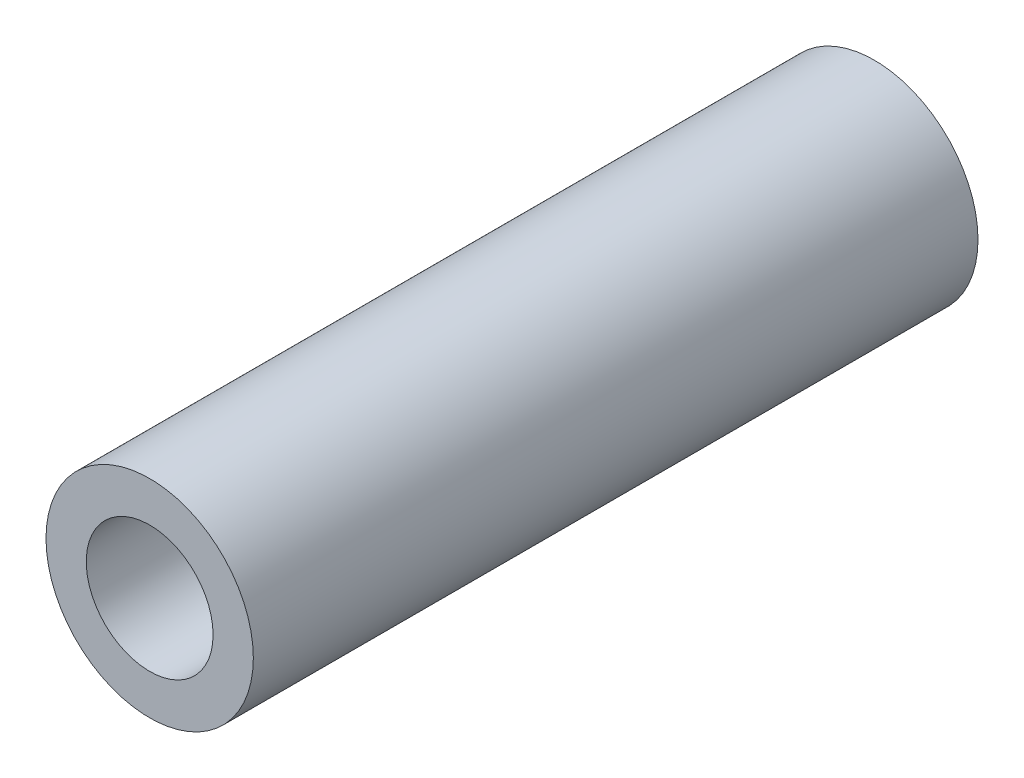
ISO-10303-21;
HEADER;
FILE_DESCRIPTION(('STEP AP214'),'2;1');
FILE_NAME('part.step','',(''),(''),'','','');
FILE_SCHEMA(('AUTOMOTIVE_DESIGN { 1 0 10303 214 1 1 1 1 }'));
ENDSEC;
DATA;
#1=APPLICATION_CONTEXT('core data for automotive mechanical design processes');
#2=APPLICATION_PROTOCOL_DEFINITION('international standard','automotive_design',2000,#1);
#3=PRODUCT_CONTEXT('',#1,'mechanical');
#4=PRODUCT('Part','Part','',(#3));
#5=PRODUCT_RELATED_PRODUCT_CATEGORY('part','',(#4));
#6=PRODUCT_DEFINITION_FORMATION('','',#4);
#7=PRODUCT_DEFINITION_CONTEXT('part definition',#1,'design');
#8=PRODUCT_DEFINITION('design','',#6,#7);
#9=PRODUCT_DEFINITION_SHAPE('','',#8);
#10=(LENGTH_UNIT() NAMED_UNIT(*) SI_UNIT(.MILLI.,.METRE.));
#11=(NAMED_UNIT(*) PLANE_ANGLE_UNIT() SI_UNIT($,.RADIAN.));
#12=(NAMED_UNIT(*) SI_UNIT($,.STERADIAN.) SOLID_ANGLE_UNIT());
#13=UNCERTAINTY_MEASURE_WITH_UNIT(LENGTH_MEASURE(1.E-05),#10,'distance_accuracy_value','');
#14=(GEOMETRIC_REPRESENTATION_CONTEXT(3) GLOBAL_UNCERTAINTY_ASSIGNED_CONTEXT((#13)) GLOBAL_UNIT_ASSIGNED_CONTEXT((#10,
#11,#12)) REPRESENTATION_CONTEXT('',''));
#15=CARTESIAN_POINT('',(0.,0.,0.));
#16=DIRECTION('',(0.,0.,1.));
#17=DIRECTION('',(1.,0.,0.));
#18=AXIS2_PLACEMENT_3D('',#15,#16,#17);
#19=CARTESIAN_POINT('',(32.5,0.,18.));
#20=DIRECTION('',(0.,0.,-1.));
#21=DIRECTION('',(-1.,0.,0.));
#22=AXIS2_PLACEMENT_3D('',#19,#20,#21);
#23=CYLINDRICAL_SURFACE('',#22,2.575);
#24=CARTESIAN_POINT('',(32.5,0.,18.));
#25=DIRECTION('',(0.,0.,1.));
#26=DIRECTION('',(1.,0.,0.));
#27=AXIS2_PLACEMENT_3D('',#24,#25,#26);
#28=CIRCLE('',#27,2.575);
#29=CARTESIAN_POINT('',(35.075,0.,18.));
#30=VERTEX_POINT('',#29);
#31=EDGE_CURVE('E10',#30,#30,#28,.T.);
#32=ORIENTED_EDGE('',*,*,#31,.F.);
#33=EDGE_LOOP('',(#32));
#34=FACE_BOUND('',#33,.T.);
#35=CARTESIAN_POINT('',(32.5,0.,0.));
#36=DIRECTION('',(0.,0.,1.));
#37=DIRECTION('',(1.,0.,0.));
#38=AXIS2_PLACEMENT_3D('',#35,#36,#37);
#39=CIRCLE('',#38,2.575);
#40=CARTESIAN_POINT('',(35.075,0.,0.));
#41=VERTEX_POINT('',#40);
#42=EDGE_CURVE('E40',#41,#41,#39,.T.);
#43=ORIENTED_EDGE('',*,*,#42,.T.);
#44=EDGE_LOOP('',(#43));
#45=FACE_BOUND('',#44,.T.);
#46=ADVANCED_FACE('F37',(#34,#45),#23,.T.);
#47=CARTESIAN_POINT('',(32.5,0.,18.));
#48=DIRECTION('',(0.,0.,1.));
#49=DIRECTION('',(1.,0.,0.));
#50=AXIS2_PLACEMENT_3D('',#47,#48,#49);
#51=PLANE('',#50);
#52=CARTESIAN_POINT('',(32.5,0.,18.));
#53=DIRECTION('',(0.,0.,1.));
#54=DIRECTION('',(1.,0.,0.));
#55=AXIS2_PLACEMENT_3D('',#52,#53,#54);
#56=CIRCLE('',#55,1.575);
#57=CARTESIAN_POINT('',(34.075,0.,18.));
#58=VERTEX_POINT('',#57);
#59=EDGE_CURVE('E51',#58,#58,#56,.T.);
#60=ORIENTED_EDGE('',*,*,#59,.F.);
#61=EDGE_LOOP('',(#60));
#62=FACE_BOUND('',#61,.T.);
#63=ORIENTED_EDGE('',*,*,#31,.T.);
#64=EDGE_LOOP('',(#63));
#65=FACE_BOUND('',#64,.T.);
#66=ADVANCED_FACE('F58',(#62,#65),#51,.T.);
#67=CARTESIAN_POINT('',(32.5,0.,0.));
#68=DIRECTION('',(0.,0.,1.));
#69=DIRECTION('',(1.,0.,0.));
#70=AXIS2_PLACEMENT_3D('',#67,#68,#69);
#71=PLANE('',#70);
#72=CARTESIAN_POINT('',(32.5,0.,0.));
#73=DIRECTION('',(0.,0.,1.));
#74=DIRECTION('',(1.,0.,0.));
#75=AXIS2_PLACEMENT_3D('',#72,#73,#74);
#76=CIRCLE('',#75,1.575);
#77=CARTESIAN_POINT('',(34.075,0.,0.));
#78=VERTEX_POINT('',#77);
#79=EDGE_CURVE('E47',#78,#78,#76,.F.);
#80=ORIENTED_EDGE('',*,*,#79,.F.);
#81=EDGE_LOOP('',(#80));
#82=FACE_BOUND('',#81,.T.);
#83=ORIENTED_EDGE('',*,*,#42,.F.);
#84=EDGE_LOOP('',(#83));
#85=FACE_BOUND('',#84,.T.);
#86=ADVANCED_FACE('F60',(#82,#85),#71,.F.);
#87=CARTESIAN_POINT('',(32.5,0.,-0.001000000000001));
#88=DIRECTION('',(0.,0.,1.));
#89=DIRECTION('',(1.,0.,0.));
#90=AXIS2_PLACEMENT_3D('',#87,#88,#89);
#91=CYLINDRICAL_SURFACE('',#90,1.575);
#92=ORIENTED_EDGE('',*,*,#59,.T.);
#93=EDGE_LOOP('',(#92));
#94=FACE_BOUND('',#93,.T.);
#95=ORIENTED_EDGE('',*,*,#79,.T.);
#96=EDGE_LOOP('',(#95));
#97=FACE_BOUND('',#96,.T.);
#98=ADVANCED_FACE('F55',(#94,#97),#91,.F.);
#99=CLOSED_SHELL('',(#46,#66,#86,#98));
#100=MANIFOLD_SOLID_BREP('B2',#99);
#101=ADVANCED_BREP_SHAPE_REPRESENTATION('',(#18,#100),#14);
#102=SHAPE_DEFINITION_REPRESENTATION(#9,#101);
ENDSEC;
END-ISO-10303-21;
